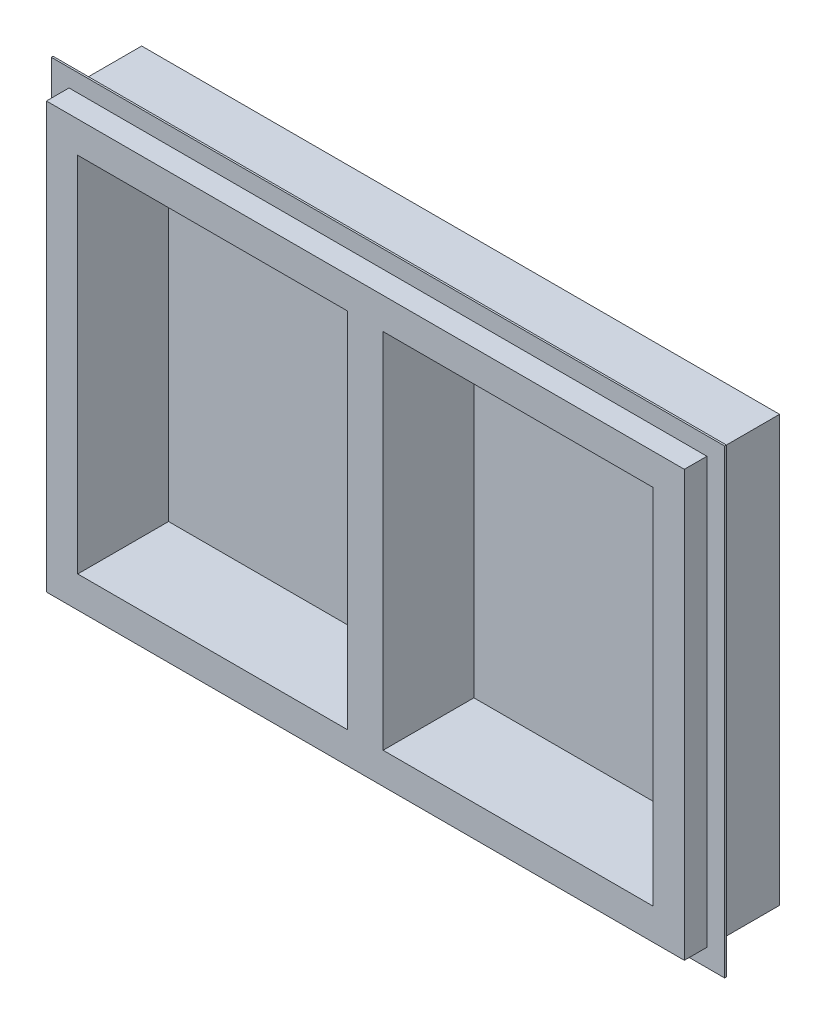
ISO-10303-21;
HEADER;
FILE_DESCRIPTION(('STEP AP214'),'2;1');
FILE_NAME('part.step','',(''),(''),'','','');
FILE_SCHEMA(('AUTOMOTIVE_DESIGN { 1 0 10303 214 1 1 1 1 }'));
ENDSEC;
DATA;
#1=APPLICATION_CONTEXT('core data for automotive mechanical design processes');
#2=APPLICATION_PROTOCOL_DEFINITION('international standard','automotive_design',2000,#1);
#3=PRODUCT_CONTEXT('',#1,'mechanical');
#4=PRODUCT('Part','Part','',(#3));
#5=PRODUCT_RELATED_PRODUCT_CATEGORY('part','',(#4));
#6=PRODUCT_DEFINITION_FORMATION('','',#4);
#7=PRODUCT_DEFINITION_CONTEXT('part definition',#1,'design');
#8=PRODUCT_DEFINITION('design','',#6,#7);
#9=PRODUCT_DEFINITION_SHAPE('','',#8);
#10=(LENGTH_UNIT() NAMED_UNIT(*) SI_UNIT(.MILLI.,.METRE.));
#11=(NAMED_UNIT(*) PLANE_ANGLE_UNIT() SI_UNIT($,.RADIAN.));
#12=(NAMED_UNIT(*) SI_UNIT($,.STERADIAN.) SOLID_ANGLE_UNIT());
#13=UNCERTAINTY_MEASURE_WITH_UNIT(LENGTH_MEASURE(1.E-05),#10,'distance_accuracy_value','');
#14=(GEOMETRIC_REPRESENTATION_CONTEXT(3) GLOBAL_UNCERTAINTY_ASSIGNED_CONTEXT((#13)) GLOBAL_UNIT_ASSIGNED_CONTEXT((#10,
#11,#12)) REPRESENTATION_CONTEXT('',''));
#15=CARTESIAN_POINT('',(0.,0.,0.));
#16=DIRECTION('',(0.,0.,1.));
#17=DIRECTION('',(1.,0.,0.));
#18=AXIS2_PLACEMENT_3D('',#15,#16,#17);
#19=CARTESIAN_POINT('',(44.9012806053457,564.698719394654,136.525));
#20=DIRECTION('',(1.,0.,0.));
#21=DIRECTION('',(0.,0.,-1.));
#22=AXIS2_PLACEMENT_3D('',#19,#20,#21);
#23=PLANE('',#22);
#24=DIRECTION('',(0.,0.,-1.));
#25=VECTOR('',#24,1.);
#26=CARTESIAN_POINT('',(44.9012806053457,44.9012806053458,136.525));
#27=LINE('',#26,#25);
#28=CARTESIAN_POINT('',(44.9012806053457,44.9012806053458,136.525));
#29=VERTEX_POINT('',#28);
#30=CARTESIAN_POINT('',(44.9012806053457,44.9012806053458,6.35));
#31=VERTEX_POINT('',#30);
#32=EDGE_CURVE('E392',#29,#31,#27,.T.);
#33=ORIENTED_EDGE('',*,*,#32,.T.);
#34=DIRECTION('',(0.,1.,0.));
#35=VECTOR('',#34,1.);
#36=CARTESIAN_POINT('',(44.9012806053457,564.698719394654,6.35));
#37=LINE('',#36,#35);
#38=CARTESIAN_POINT('',(44.9012806053457,564.698719394654,6.35));
#39=VERTEX_POINT('',#38);
#40=EDGE_CURVE('E263',#31,#39,#37,.T.);
#41=ORIENTED_EDGE('',*,*,#40,.T.);
#42=DIRECTION('',(0.,0.,-1.));
#43=VECTOR('',#42,1.);
#44=CARTESIAN_POINT('',(44.9012806053457,564.698719394654,136.525));
#45=LINE('',#44,#43);
#46=CARTESIAN_POINT('',(44.9012806053457,564.698719394654,136.525));
#47=VERTEX_POINT('',#46);
#48=EDGE_CURVE('E383',#47,#39,#45,.T.);
#49=ORIENTED_EDGE('',*,*,#48,.F.);
#50=DIRECTION('',(0.,-1.,0.));
#51=VECTOR('',#50,1.);
#52=CARTESIAN_POINT('',(44.9012806053457,564.698719394654,136.525));
#53=LINE('',#52,#51);
#54=EDGE_CURVE('E374',#47,#29,#53,.T.);
#55=ORIENTED_EDGE('',*,*,#54,.T.);
#56=EDGE_LOOP('',(#33,#41,#49,#55));
#57=FACE_BOUND('',#56,.T.);
#58=ADVANCED_FACE('F38',(#57),#23,.T.);
#59=CARTESIAN_POINT('',(44.9012806053457,44.9012806053458,136.525));
#60=DIRECTION('',(0.,1.,0.));
#61=DIRECTION('',(0.,0.,1.));
#62=AXIS2_PLACEMENT_3D('',#59,#60,#61);
#63=PLANE('',#62);
#64=DIRECTION('',(0.,0.,-1.));
#65=VECTOR('',#64,1.);
#66=CARTESIAN_POINT('',(431.8,44.9012806053458,136.525));
#67=LINE('',#66,#65);
#68=CARTESIAN_POINT('',(431.8,44.9012806053458,136.525));
#69=VERTEX_POINT('',#68);
#70=CARTESIAN_POINT('',(431.8,44.9012806053458,6.35));
#71=VERTEX_POINT('',#70);
#72=EDGE_CURVE('E389',#69,#71,#67,.T.);
#73=ORIENTED_EDGE('',*,*,#72,.T.);
#74=DIRECTION('',(-1.,0.,0.));
#75=VECTOR('',#74,1.);
#76=CARTESIAN_POINT('',(431.8,44.9012806053458,6.35));
#77=LINE('',#76,#75);
#78=EDGE_CURVE('E260',#71,#31,#77,.T.);
#79=ORIENTED_EDGE('',*,*,#78,.T.);
#80=ORIENTED_EDGE('',*,*,#32,.F.);
#81=DIRECTION('',(1.,0.,0.));
#82=VECTOR('',#81,1.);
#83=CARTESIAN_POINT('',(44.9012806053457,44.9012806053458,136.525));
#84=LINE('',#83,#82);
#85=EDGE_CURVE('E376',#29,#69,#84,.T.);
#86=ORIENTED_EDGE('',*,*,#85,.T.);
#87=EDGE_LOOP('',(#73,#79,#80,#86));
#88=FACE_BOUND('',#87,.T.);
#89=ADVANCED_FACE('F482',(#88),#63,.T.);
#90=CARTESIAN_POINT('',(431.8,564.698719394654,136.525));
#91=DIRECTION('',(-1.,0.,0.));
#92=DIRECTION('',(0.,0.,1.));
#93=AXIS2_PLACEMENT_3D('',#90,#91,#92);
#94=PLANE('',#93);
#95=DIRECTION('',(0.,0.,-1.));
#96=VECTOR('',#95,1.);
#97=CARTESIAN_POINT('',(431.8,564.698719394654,136.525));
#98=LINE('',#97,#96);
#99=CARTESIAN_POINT('',(431.8,564.698719394654,136.525));
#100=VERTEX_POINT('',#99);
#101=CARTESIAN_POINT('',(431.8,564.698719394654,6.34999999999999));
#102=VERTEX_POINT('',#101);
#103=EDGE_CURVE('E386',#100,#102,#98,.T.);
#104=ORIENTED_EDGE('',*,*,#103,.T.);
#105=DIRECTION('',(0.,-1.,0.));
#106=VECTOR('',#105,1.);
#107=CARTESIAN_POINT('',(431.8,564.698719394654,6.35));
#108=LINE('',#107,#106);
#109=EDGE_CURVE('E53',#102,#71,#108,.T.);
#110=ORIENTED_EDGE('',*,*,#109,.T.);
#111=ORIENTED_EDGE('',*,*,#72,.F.);
#112=DIRECTION('',(0.,1.,0.));
#113=VECTOR('',#112,1.);
#114=CARTESIAN_POINT('',(431.8,564.698719394654,136.525));
#115=LINE('',#114,#113);
#116=EDGE_CURVE('E378',#69,#100,#115,.T.);
#117=ORIENTED_EDGE('',*,*,#116,.T.);
#118=EDGE_LOOP('',(#104,#110,#111,#117));
#119=FACE_BOUND('',#118,.T.);
#120=ADVANCED_FACE('F488',(#119),#94,.T.);
#121=CARTESIAN_POINT('',(44.9012806053457,564.698719394654,136.525));
#122=DIRECTION('',(0.,-1.,0.));
#123=DIRECTION('',(0.,0.,-1.));
#124=AXIS2_PLACEMENT_3D('',#121,#122,#123);
#125=PLANE('',#124);
#126=ORIENTED_EDGE('',*,*,#48,.T.);
#127=DIRECTION('',(1.,0.,0.));
#128=VECTOR('',#127,1.);
#129=CARTESIAN_POINT('',(431.8,564.698719394654,6.35));
#130=LINE('',#129,#128);
#131=EDGE_CURVE('E240',#39,#102,#130,.T.);
#132=ORIENTED_EDGE('',*,*,#131,.T.);
#133=ORIENTED_EDGE('',*,*,#103,.F.);
#134=DIRECTION('',(-1.,0.,0.));
#135=VECTOR('',#134,1.);
#136=CARTESIAN_POINT('',(44.9012806053457,564.698719394654,136.525));
#137=LINE('',#136,#135);
#138=EDGE_CURVE('E381',#100,#47,#137,.T.);
#139=ORIENTED_EDGE('',*,*,#138,.T.);
#140=EDGE_LOOP('',(#126,#132,#133,#139));
#141=FACE_BOUND('',#140,.T.);
#142=ADVANCED_FACE('F723',(#141),#125,.T.);
#143=CARTESIAN_POINT('',(482.6,44.9012806053458,136.525));
#144=DIRECTION('',(1.,0.,0.));
#145=DIRECTION('',(0.,0.,-1.));
#146=AXIS2_PLACEMENT_3D('',#143,#144,#145);
#147=PLANE('',#146);
#148=DIRECTION('',(0.,0.,-1.));
#149=VECTOR('',#148,1.);
#150=CARTESIAN_POINT('',(482.6,44.9012806053458,136.525));
#151=LINE('',#150,#149);
#152=CARTESIAN_POINT('',(482.6,44.9012806053458,136.525));
#153=VERTEX_POINT('',#152);
#154=CARTESIAN_POINT('',(482.6,44.9012806053458,6.35));
#155=VERTEX_POINT('',#154);
#156=EDGE_CURVE('E371',#153,#155,#151,.T.);
#157=ORIENTED_EDGE('',*,*,#156,.T.);
#158=DIRECTION('',(0.,1.,0.));
#159=VECTOR('',#158,1.);
#160=CARTESIAN_POINT('',(482.6,564.698719394654,6.35));
#161=LINE('',#160,#159);
#162=CARTESIAN_POINT('',(482.6,564.698719394654,6.35));
#163=VERTEX_POINT('',#162);
#164=EDGE_CURVE('E288',#155,#163,#161,.T.);
#165=ORIENTED_EDGE('',*,*,#164,.T.);
#166=DIRECTION('',(0.,0.,-1.));
#167=VECTOR('',#166,1.);
#168=CARTESIAN_POINT('',(482.6,564.698719394654,136.525));
#169=LINE('',#168,#167);
#170=CARTESIAN_POINT('',(482.6,564.698719394654,136.525));
#171=VERTEX_POINT('',#170);
#172=EDGE_CURVE('E362',#171,#163,#169,.T.);
#173=ORIENTED_EDGE('',*,*,#172,.F.);
#174=DIRECTION('',(0.,-1.,0.));
#175=VECTOR('',#174,1.);
#176=CARTESIAN_POINT('',(482.6,44.9012806053458,136.525));
#177=LINE('',#176,#175);
#178=EDGE_CURVE('E353',#171,#153,#177,.T.);
#179=ORIENTED_EDGE('',*,*,#178,.T.);
#180=EDGE_LOOP('',(#157,#165,#173,#179));
#181=FACE_BOUND('',#180,.T.);
#182=ADVANCED_FACE('F733',(#181),#147,.T.);
#183=CARTESIAN_POINT('',(482.6,44.9012806053458,136.525));
#184=DIRECTION('',(0.,1.,0.));
#185=DIRECTION('',(0.,0.,1.));
#186=AXIS2_PLACEMENT_3D('',#183,#184,#185);
#187=PLANE('',#186);
#188=DIRECTION('',(0.,0.,-1.));
#189=VECTOR('',#188,1.);
#190=CARTESIAN_POINT('',(869.498719394654,44.9012806053458,136.525));
#191=LINE('',#190,#189);
#192=CARTESIAN_POINT('',(869.498719394654,44.9012806053458,136.525));
#193=VERTEX_POINT('',#192);
#194=CARTESIAN_POINT('',(869.498719394654,44.9012806053458,6.35));
#195=VERTEX_POINT('',#194);
#196=EDGE_CURVE('E368',#193,#195,#191,.T.);
#197=ORIENTED_EDGE('',*,*,#196,.T.);
#198=DIRECTION('',(-1.,0.,0.));
#199=VECTOR('',#198,1.);
#200=CARTESIAN_POINT('',(869.498719394654,44.9012806053458,6.35));
#201=LINE('',#200,#199);
#202=EDGE_CURVE('E285',#195,#155,#201,.T.);
#203=ORIENTED_EDGE('',*,*,#202,.T.);
#204=ORIENTED_EDGE('',*,*,#156,.F.);
#205=DIRECTION('',(1.,0.,0.));
#206=VECTOR('',#205,1.);
#207=CARTESIAN_POINT('',(482.6,44.9012806053458,136.525));
#208=LINE('',#207,#206);
#209=EDGE_CURVE('E355',#153,#193,#208,.T.);
#210=ORIENTED_EDGE('',*,*,#209,.T.);
#211=EDGE_LOOP('',(#197,#203,#204,#210));
#212=FACE_BOUND('',#211,.T.);
#213=ADVANCED_FACE('F744',(#212),#187,.T.);
#214=CARTESIAN_POINT('',(869.498719394654,44.9012806053458,136.525));
#215=DIRECTION('',(-1.,0.,0.));
#216=DIRECTION('',(0.,0.,1.));
#217=AXIS2_PLACEMENT_3D('',#214,#215,#216);
#218=PLANE('',#217);
#219=DIRECTION('',(0.,0.,-1.));
#220=VECTOR('',#219,1.);
#221=CARTESIAN_POINT('',(869.498719394654,564.698719394654,136.525));
#222=LINE('',#221,#220);
#223=CARTESIAN_POINT('',(869.498719394654,564.698719394654,136.525));
#224=VERTEX_POINT('',#223);
#225=CARTESIAN_POINT('',(869.498719394654,564.698719394654,6.34999999999999));
#226=VERTEX_POINT('',#225);
#227=EDGE_CURVE('E365',#224,#226,#222,.T.);
#228=ORIENTED_EDGE('',*,*,#227,.T.);
#229=DIRECTION('',(0.,-1.,0.));
#230=VECTOR('',#229,1.);
#231=CARTESIAN_POINT('',(869.498719394654,564.698719394654,6.35));
#232=LINE('',#231,#230);
#233=EDGE_CURVE('E61',#226,#195,#232,.T.);
#234=ORIENTED_EDGE('',*,*,#233,.T.);
#235=ORIENTED_EDGE('',*,*,#196,.F.);
#236=DIRECTION('',(0.,1.,0.));
#237=VECTOR('',#236,1.);
#238=CARTESIAN_POINT('',(869.498719394654,44.9012806053458,136.525));
#239=LINE('',#238,#237);
#240=EDGE_CURVE('E357',#193,#224,#239,.T.);
#241=ORIENTED_EDGE('',*,*,#240,.T.);
#242=EDGE_LOOP('',(#228,#234,#235,#241));
#243=FACE_BOUND('',#242,.T.);
#244=ADVANCED_FACE('F755',(#243),#218,.T.);
#245=CARTESIAN_POINT('',(482.6,564.698719394654,136.525));
#246=DIRECTION('',(0.,-1.,0.));
#247=DIRECTION('',(0.,0.,-1.));
#248=AXIS2_PLACEMENT_3D('',#245,#246,#247);
#249=PLANE('',#248);
#250=ORIENTED_EDGE('',*,*,#172,.T.);
#251=DIRECTION('',(1.,0.,0.));
#252=VECTOR('',#251,1.);
#253=CARTESIAN_POINT('',(869.498719394654,564.698719394654,6.35));
#254=LINE('',#253,#252);
#255=EDGE_CURVE('E291',#163,#226,#254,.T.);
#256=ORIENTED_EDGE('',*,*,#255,.T.);
#257=ORIENTED_EDGE('',*,*,#227,.F.);
#258=DIRECTION('',(-1.,0.,0.));
#259=VECTOR('',#258,1.);
#260=CARTESIAN_POINT('',(482.6,564.698719394654,136.525));
#261=LINE('',#260,#259);
#262=EDGE_CURVE('E360',#224,#171,#261,.T.);
#263=ORIENTED_EDGE('',*,*,#262,.T.);
#264=EDGE_LOOP('',(#250,#256,#257,#263));
#265=FACE_BOUND('',#264,.T.);
#266=ADVANCED_FACE('F516',(#265),#249,.T.);
#267=CARTESIAN_POINT('',(0.,0.,101.6));
#268=DIRECTION('',(0.,0.,-1.));
#269=DIRECTION('',(-1.,0.,0.));
#270=AXIS2_PLACEMENT_3D('',#267,#268,#269);
#271=PLANE('',#270);
#272=DIRECTION('',(0.,-1.,0.));
#273=VECTOR('',#272,1.);
#274=CARTESIAN_POINT('',(-25.3999999999999,-25.4000000000001,101.6));
#275=LINE('',#274,#273);
#276=CARTESIAN_POINT('',(-25.3999999999999,635.,101.6));
#277=VERTEX_POINT('',#276);
#278=CARTESIAN_POINT('',(-25.3999999999999,-25.4000000000001,101.6));
#279=VERTEX_POINT('',#278);
#280=EDGE_CURVE('E428',#277,#279,#275,.T.);
#281=ORIENTED_EDGE('',*,*,#280,.F.);
#282=DIRECTION('',(-1.,0.,0.));
#283=VECTOR('',#282,1.);
#284=CARTESIAN_POINT('',(0.,635.,101.6));
#285=LINE('',#284,#283);
#286=CARTESIAN_POINT('',(939.8,635.,101.6));
#287=VERTEX_POINT('',#286);
#288=EDGE_CURVE('E433',#287,#277,#285,.T.);
#289=ORIENTED_EDGE('',*,*,#288,.F.);
#290=DIRECTION('',(0.,1.,0.));
#291=VECTOR('',#290,1.);
#292=CARTESIAN_POINT('',(939.8,635.,101.6));
#293=LINE('',#292,#291);
#294=CARTESIAN_POINT('',(939.8,-25.4,101.6));
#295=VERTEX_POINT('',#294);
#296=EDGE_CURVE('E444',#295,#287,#293,.T.);
#297=ORIENTED_EDGE('',*,*,#296,.F.);
#298=DIRECTION('',(1.,0.,0.));
#299=VECTOR('',#298,1.);
#300=CARTESIAN_POINT('',(939.8,-25.4,101.6));
#301=LINE('',#300,#299);
#302=EDGE_CURVE('E442',#279,#295,#301,.T.);
#303=ORIENTED_EDGE('',*,*,#302,.F.);
#304=EDGE_LOOP('',(#281,#289,#297,#303));
#305=FACE_BOUND('',#304,.T.);
#306=DIRECTION('',(-1.,0.,0.));
#307=VECTOR('',#306,1.);
#308=CARTESIAN_POINT('',(0.,609.6,101.6));
#309=LINE('',#308,#307);
#310=CARTESIAN_POINT('',(914.4,609.6,101.6));
#311=VERTEX_POINT('',#310);
#312=CARTESIAN_POINT('',(0.,609.6,101.6));
#313=VERTEX_POINT('',#312);
#314=EDGE_CURVE('E331',#311,#313,#309,.T.);
#315=ORIENTED_EDGE('',*,*,#314,.T.);
#316=DIRECTION('',(0.,-1.,0.));
#317=VECTOR('',#316,1.);
#318=CARTESIAN_POINT('',(0.,0.,101.6));
#319=LINE('',#318,#317);
#320=CARTESIAN_POINT('',(0.,0.,101.6));
#321=VERTEX_POINT('',#320);
#322=EDGE_CURVE('E321',#313,#321,#319,.T.);
#323=ORIENTED_EDGE('',*,*,#322,.T.);
#324=DIRECTION('',(1.,0.,0.));
#325=VECTOR('',#324,1.);
#326=CARTESIAN_POINT('',(0.,0.,101.6));
#327=LINE('',#326,#325);
#328=CARTESIAN_POINT('',(914.4,0.,101.6));
#329=VERTEX_POINT('',#328);
#330=EDGE_CURVE('E324',#321,#329,#327,.T.);
#331=ORIENTED_EDGE('',*,*,#330,.T.);
#332=DIRECTION('',(0.,1.,0.));
#333=VECTOR('',#332,1.);
#334=CARTESIAN_POINT('',(914.4,0.,101.6));
#335=LINE('',#334,#333);
#336=EDGE_CURVE('E328',#329,#311,#335,.T.);
#337=ORIENTED_EDGE('',*,*,#336,.T.);
#338=EDGE_LOOP('',(#315,#323,#331,#337));
#339=FACE_BOUND('',#338,.T.);
#340=ADVANCED_FACE('F462',(#305,#339),#271,.T.);
#341=CARTESIAN_POINT('',(0.,0.,104.14));
#342=DIRECTION('',(0.,0.,-1.));
#343=DIRECTION('',(-1.,0.,0.));
#344=AXIS2_PLACEMENT_3D('',#341,#342,#343);
#345=PLANE('',#344);
#346=DIRECTION('',(-1.,0.,0.));
#347=VECTOR('',#346,1.);
#348=CARTESIAN_POINT('',(-25.3999999999999,635.,104.14));
#349=LINE('',#348,#347);
#350=CARTESIAN_POINT('',(939.8,635.,104.14));
#351=VERTEX_POINT('',#350);
#352=CARTESIAN_POINT('',(-25.3999999999999,635.,104.14));
#353=VERTEX_POINT('',#352);
#354=EDGE_CURVE('E429',#351,#353,#349,.T.);
#355=ORIENTED_EDGE('',*,*,#354,.T.);
#356=DIRECTION('',(0.,-1.,0.));
#357=VECTOR('',#356,1.);
#358=CARTESIAN_POINT('',(-25.3999999999999,-25.4000000000001,104.14));
#359=LINE('',#358,#357);
#360=CARTESIAN_POINT('',(-25.3999999999999,-25.4000000000001,104.14));
#361=VERTEX_POINT('',#360);
#362=EDGE_CURVE('E432',#353,#361,#359,.T.);
#363=ORIENTED_EDGE('',*,*,#362,.T.);
#364=DIRECTION('',(1.,0.,0.));
#365=VECTOR('',#364,1.);
#366=CARTESIAN_POINT('',(939.8,-25.4,104.14));
#367=LINE('',#366,#365);
#368=CARTESIAN_POINT('',(939.8,-25.4,104.14));
#369=VERTEX_POINT('',#368);
#370=EDGE_CURVE('E435',#361,#369,#367,.T.);
#371=ORIENTED_EDGE('',*,*,#370,.T.);
#372=DIRECTION('',(0.,1.,0.));
#373=VECTOR('',#372,1.);
#374=CARTESIAN_POINT('',(939.8,635.,104.14));
#375=LINE('',#374,#373);
#376=EDGE_CURVE('E437',#369,#351,#375,.T.);
#377=ORIENTED_EDGE('',*,*,#376,.T.);
#378=EDGE_LOOP('',(#355,#363,#371,#377));
#379=FACE_BOUND('',#378,.T.);
#380=DIRECTION('',(0.,-1.,0.));
#381=VECTOR('',#380,1.);
#382=CARTESIAN_POINT('',(0.,609.6,104.14));
#383=LINE('',#382,#381);
#384=CARTESIAN_POINT('',(0.,609.6,104.14));
#385=VERTEX_POINT('',#384);
#386=CARTESIAN_POINT('',(0.,0.,104.14));
#387=VERTEX_POINT('',#386);
#388=EDGE_CURVE('E416',#385,#387,#383,.T.);
#389=ORIENTED_EDGE('',*,*,#388,.F.);
#390=DIRECTION('',(-1.,0.,0.));
#391=VECTOR('',#390,1.);
#392=CARTESIAN_POINT('',(0.,609.6,104.14));
#393=LINE('',#392,#391);
#394=CARTESIAN_POINT('',(914.4,609.6,104.14));
#395=VERTEX_POINT('',#394);
#396=EDGE_CURVE('E425',#395,#385,#393,.T.);
#397=ORIENTED_EDGE('',*,*,#396,.F.);
#398=DIRECTION('',(0.,1.,0.));
#399=VECTOR('',#398,1.);
#400=CARTESIAN_POINT('',(914.4,609.6,104.14));
#401=LINE('',#400,#399);
#402=CARTESIAN_POINT('',(914.4,0.,104.14));
#403=VERTEX_POINT('',#402);
#404=EDGE_CURVE('E422',#403,#395,#401,.T.);
#405=ORIENTED_EDGE('',*,*,#404,.F.);
#406=DIRECTION('',(1.,0.,0.));
#407=VECTOR('',#406,1.);
#408=CARTESIAN_POINT('',(0.,0.,104.14));
#409=LINE('',#408,#407);
#410=EDGE_CURVE('E419',#387,#403,#409,.T.);
#411=ORIENTED_EDGE('',*,*,#410,.F.);
#412=EDGE_LOOP('',(#389,#397,#405,#411));
#413=FACE_BOUND('',#412,.T.);
#414=ADVANCED_FACE('F473',(#379,#413),#345,.F.);
#415=CARTESIAN_POINT('',(-25.3999999999999,-25.4000000000001,104.14));
#416=DIRECTION('',(1.,0.,0.));
#417=DIRECTION('',(0.,0.,-1.));
#418=AXIS2_PLACEMENT_3D('',#415,#416,#417);
#419=PLANE('',#418);
#420=ORIENTED_EDGE('',*,*,#280,.T.);
#421=DIRECTION('',(0.,0.,-1.));
#422=VECTOR('',#421,1.);
#423=CARTESIAN_POINT('',(-25.3999999999999,-25.4000000000001,104.14));
#424=LINE('',#423,#422);
#425=EDGE_CURVE('E46',#361,#279,#424,.T.);
#426=ORIENTED_EDGE('',*,*,#425,.F.);
#427=ORIENTED_EDGE('',*,*,#362,.F.);
#428=DIRECTION('',(0.,0.,-1.));
#429=VECTOR('',#428,1.);
#430=CARTESIAN_POINT('',(-25.3999999999999,635.,104.14));
#431=LINE('',#430,#429);
#432=EDGE_CURVE('E11',#353,#277,#431,.T.);
#433=ORIENTED_EDGE('',*,*,#432,.T.);
#434=EDGE_LOOP('',(#420,#426,#427,#433));
#435=FACE_BOUND('',#434,.T.);
#436=ADVANCED_FACE('F40',(#435),#419,.F.);
#437=CARTESIAN_POINT('',(939.8,-25.4,104.14));
#438=DIRECTION('',(0.,1.,0.));
#439=DIRECTION('',(-1.,0.,0.));
#440=AXIS2_PLACEMENT_3D('',#437,#438,#439);
#441=PLANE('',#440);
#442=ORIENTED_EDGE('',*,*,#302,.T.);
#443=DIRECTION('',(0.,0.,-1.));
#444=VECTOR('',#443,1.);
#445=CARTESIAN_POINT('',(939.8,-25.4,104.14));
#446=LINE('',#445,#444);
#447=EDGE_CURVE('E449',#369,#295,#446,.T.);
#448=ORIENTED_EDGE('',*,*,#447,.F.);
#449=ORIENTED_EDGE('',*,*,#370,.F.);
#450=ORIENTED_EDGE('',*,*,#425,.T.);
#451=EDGE_LOOP('',(#442,#448,#449,#450));
#452=FACE_BOUND('',#451,.T.);
#453=ADVANCED_FACE('F456',(#452),#441,.F.);
#454=CARTESIAN_POINT('',(939.8,635.,104.14));
#455=DIRECTION('',(-1.,0.,0.));
#456=DIRECTION('',(0.,-1.,0.));
#457=AXIS2_PLACEMENT_3D('',#454,#455,#456);
#458=PLANE('',#457);
#459=ORIENTED_EDGE('',*,*,#296,.T.);
#460=DIRECTION('',(0.,0.,-1.));
#461=VECTOR('',#460,1.);
#462=CARTESIAN_POINT('',(939.8,635.,104.14));
#463=LINE('',#462,#461);
#464=EDGE_CURVE('E440',#351,#287,#463,.T.);
#465=ORIENTED_EDGE('',*,*,#464,.F.);
#466=ORIENTED_EDGE('',*,*,#376,.F.);
#467=ORIENTED_EDGE('',*,*,#447,.T.);
#468=EDGE_LOOP('',(#459,#465,#466,#467));
#469=FACE_BOUND('',#468,.T.);
#470=ADVANCED_FACE('F467',(#469),#458,.F.);
#471=CARTESIAN_POINT('',(0.,635.,104.14));
#472=DIRECTION('',(0.,-1.,0.));
#473=DIRECTION('',(0.,0.,-1.));
#474=AXIS2_PLACEMENT_3D('',#471,#472,#473);
#475=PLANE('',#474);
#476=ORIENTED_EDGE('',*,*,#288,.T.);
#477=ORIENTED_EDGE('',*,*,#432,.F.);
#478=ORIENTED_EDGE('',*,*,#354,.F.);
#479=ORIENTED_EDGE('',*,*,#464,.T.);
#480=EDGE_LOOP('',(#476,#477,#478,#479));
#481=FACE_BOUND('',#480,.T.);
#482=ADVANCED_FACE('F470',(#481),#475,.F.);
#483=CARTESIAN_POINT('',(0.,0.,136.525));
#484=DIRECTION('',(0.,1.,0.));
#485=DIRECTION('',(0.,0.,1.));
#486=AXIS2_PLACEMENT_3D('',#483,#484,#485);
#487=PLANE('',#486);
#488=DIRECTION('',(0.,0.,-1.));
#489=VECTOR('',#488,1.);
#490=CARTESIAN_POINT('',(0.,0.,136.525));
#491=LINE('',#490,#489);
#492=CARTESIAN_POINT('',(0.,0.,136.525));
#493=VERTEX_POINT('',#492);
#494=EDGE_CURVE('E413',#493,#387,#491,.T.);
#495=ORIENTED_EDGE('',*,*,#494,.T.);
#496=ORIENTED_EDGE('',*,*,#410,.T.);
#497=DIRECTION('',(0.,0.,-1.));
#498=VECTOR('',#497,1.);
#499=CARTESIAN_POINT('',(914.4,0.,136.525));
#500=LINE('',#499,#498);
#501=CARTESIAN_POINT('',(914.4,0.,136.525));
#502=VERTEX_POINT('',#501);
#503=EDGE_CURVE('E410',#502,#403,#500,.T.);
#504=ORIENTED_EDGE('',*,*,#503,.F.);
#505=DIRECTION('',(1.,0.,0.));
#506=VECTOR('',#505,1.);
#507=CARTESIAN_POINT('',(0.,0.,136.525));
#508=LINE('',#507,#506);
#509=EDGE_CURVE('E398',#493,#502,#508,.T.);
#510=ORIENTED_EDGE('',*,*,#509,.F.);
#511=EDGE_LOOP('',(#495,#496,#504,#510));
#512=FACE_BOUND('',#511,.T.);
#513=ADVANCED_FACE('F503',(#512),#487,.F.);
#514=CARTESIAN_POINT('',(0.,609.6,136.525));
#515=DIRECTION('',(0.,-1.,0.));
#516=DIRECTION('',(0.,0.,-1.));
#517=AXIS2_PLACEMENT_3D('',#514,#515,#516);
#518=PLANE('',#517);
#519=DIRECTION('',(0.,0.,-1.));
#520=VECTOR('',#519,1.);
#521=CARTESIAN_POINT('',(914.4,609.6,136.525));
#522=LINE('',#521,#520);
#523=CARTESIAN_POINT('',(914.4,609.6,136.525));
#524=VERTEX_POINT('',#523);
#525=EDGE_CURVE('E407',#524,#395,#522,.T.);
#526=ORIENTED_EDGE('',*,*,#525,.T.);
#527=ORIENTED_EDGE('',*,*,#396,.T.);
#528=DIRECTION('',(0.,0.,-1.));
#529=VECTOR('',#528,1.);
#530=CARTESIAN_POINT('',(0.,609.6,136.525));
#531=LINE('',#530,#529);
#532=CARTESIAN_POINT('',(0.,609.6,136.525));
#533=VERTEX_POINT('',#532);
#534=EDGE_CURVE('E404',#533,#385,#531,.T.);
#535=ORIENTED_EDGE('',*,*,#534,.F.);
#536=DIRECTION('',(-1.,0.,0.));
#537=VECTOR('',#536,1.);
#538=CARTESIAN_POINT('',(0.,609.6,136.525));
#539=LINE('',#538,#537);
#540=EDGE_CURVE('E402',#524,#533,#539,.T.);
#541=ORIENTED_EDGE('',*,*,#540,.F.);
#542=EDGE_LOOP('',(#526,#527,#535,#541));
#543=FACE_BOUND('',#542,.T.);
#544=ADVANCED_FACE('F499',(#543),#518,.F.);
#545=CARTESIAN_POINT('',(0.,609.6,136.525));
#546=DIRECTION('',(1.,0.,0.));
#547=DIRECTION('',(0.,0.,-1.));
#548=AXIS2_PLACEMENT_3D('',#545,#546,#547);
#549=PLANE('',#548);
#550=ORIENTED_EDGE('',*,*,#534,.T.);
#551=ORIENTED_EDGE('',*,*,#388,.T.);
#552=ORIENTED_EDGE('',*,*,#494,.F.);
#553=DIRECTION('',(0.,-1.,0.));
#554=VECTOR('',#553,1.);
#555=CARTESIAN_POINT('',(0.,609.6,136.525));
#556=LINE('',#555,#554);
#557=EDGE_CURVE('E395',#533,#493,#556,.T.);
#558=ORIENTED_EDGE('',*,*,#557,.F.);
#559=EDGE_LOOP('',(#550,#551,#552,#558));
#560=FACE_BOUND('',#559,.T.);
#561=ADVANCED_FACE('F502',(#560),#549,.F.);
#562=CARTESIAN_POINT('',(914.4,609.6,136.525));
#563=DIRECTION('',(-1.,0.,0.));
#564=DIRECTION('',(0.,0.,1.));
#565=AXIS2_PLACEMENT_3D('',#562,#563,#564);
#566=PLANE('',#565);
#567=ORIENTED_EDGE('',*,*,#503,.T.);
#568=ORIENTED_EDGE('',*,*,#404,.T.);
#569=ORIENTED_EDGE('',*,*,#525,.F.);
#570=DIRECTION('',(0.,1.,0.));
#571=VECTOR('',#570,1.);
#572=CARTESIAN_POINT('',(914.4,609.6,136.525));
#573=LINE('',#572,#571);
#574=EDGE_CURVE('E400',#502,#524,#573,.T.);
#575=ORIENTED_EDGE('',*,*,#574,.F.);
#576=EDGE_LOOP('',(#567,#568,#569,#575));
#577=FACE_BOUND('',#576,.T.);
#578=ADVANCED_FACE('F497',(#577),#566,.F.);
#579=CARTESIAN_POINT('',(0.,0.,136.525));
#580=DIRECTION('',(0.,0.,1.));
#581=DIRECTION('',(1.,0.,0.));
#582=AXIS2_PLACEMENT_3D('',#579,#580,#581);
#583=PLANE('',#582);
#584=ORIENTED_EDGE('',*,*,#557,.T.);
#585=ORIENTED_EDGE('',*,*,#509,.T.);
#586=ORIENTED_EDGE('',*,*,#574,.T.);
#587=ORIENTED_EDGE('',*,*,#540,.T.);
#588=EDGE_LOOP('',(#584,#585,#586,#587));
#589=FACE_BOUND('',#588,.T.);
#590=ORIENTED_EDGE('',*,*,#85,.F.);
#591=ORIENTED_EDGE('',*,*,#54,.F.);
#592=ORIENTED_EDGE('',*,*,#138,.F.);
#593=ORIENTED_EDGE('',*,*,#116,.F.);
#594=EDGE_LOOP('',(#590,#591,#592,#593));
#595=FACE_BOUND('',#594,.T.);
#596=ORIENTED_EDGE('',*,*,#209,.F.);
#597=ORIENTED_EDGE('',*,*,#178,.F.);
#598=ORIENTED_EDGE('',*,*,#262,.F.);
#599=ORIENTED_EDGE('',*,*,#240,.F.);
#600=EDGE_LOOP('',(#596,#597,#598,#599));
#601=FACE_BOUND('',#600,.T.);
#602=ADVANCED_FACE('F493',(#589,#595,#601),#583,.T.);
#603=CARTESIAN_POINT('',(0.,0.,0.));
#604=DIRECTION('',(0.,0.,-1.));
#605=DIRECTION('',(-1.,0.,0.));
#606=AXIS2_PLACEMENT_3D('',#603,#604,#605);
#607=PLANE('',#606);
#608=DIRECTION('',(0.,-1.,0.));
#609=VECTOR('',#608,1.);
#610=CARTESIAN_POINT('',(457.2,609.602,0.));
#611=LINE('',#610,#609);
#612=CARTESIAN_POINT('',(457.2,564.698719394654,0.));
#613=VERTEX_POINT('',#612);
#614=CARTESIAN_POINT('',(457.2,44.9012806053458,0.));
#615=VERTEX_POINT('',#614);
#616=EDGE_CURVE('E305',#613,#615,#611,.T.);
#617=ORIENTED_EDGE('',*,*,#616,.F.);
#618=ORIENTED_EDGE('',*,*,#616,.T.);
#619=EDGE_LOOP('',(#617,#618));
#620=FACE_BOUND('',#619,.T.);
#621=DIRECTION('',(-1.,0.,0.));
#622=VECTOR('',#621,1.);
#623=CARTESIAN_POINT('',(44.9012806053457,564.698719394654,0.));
#624=LINE('',#623,#622);
#625=CARTESIAN_POINT('',(869.498719394654,564.698719394654,0.));
#626=VERTEX_POINT('',#625);
#627=CARTESIAN_POINT('',(482.6,564.698719394654,0.));
#628=VERTEX_POINT('',#627);
#629=EDGE_CURVE('E311',#626,#628,#624,.T.);
#630=ORIENTED_EDGE('',*,*,#629,.T.);
#631=DIRECTION('',(0.,-1.,0.));
#632=VECTOR('',#631,1.);
#633=CARTESIAN_POINT('',(482.6,609.602,0.));
#634=LINE('',#633,#632);
#635=CARTESIAN_POINT('',(482.6,44.9012806053458,0.));
#636=VERTEX_POINT('',#635);
#637=EDGE_CURVE('E302',#628,#636,#634,.T.);
#638=ORIENTED_EDGE('',*,*,#637,.T.);
#639=DIRECTION('',(1.,0.,0.));
#640=VECTOR('',#639,1.);
#641=CARTESIAN_POINT('',(869.498719394654,44.9012806053458,0.));
#642=LINE('',#641,#640);
#643=CARTESIAN_POINT('',(869.498719394654,44.9012806053458,0.));
#644=VERTEX_POINT('',#643);
#645=EDGE_CURVE('E317',#636,#644,#642,.T.);
#646=ORIENTED_EDGE('',*,*,#645,.T.);
#647=DIRECTION('',(0.,1.,0.));
#648=VECTOR('',#647,1.);
#649=CARTESIAN_POINT('',(869.498719394654,564.698719394654,0.));
#650=LINE('',#649,#648);
#651=EDGE_CURVE('E307',#644,#626,#650,.T.);
#652=ORIENTED_EDGE('',*,*,#651,.T.);
#653=EDGE_LOOP('',(#630,#638,#646,#652));
#654=FACE_BOUND('',#653,.T.);
#655=DIRECTION('',(0.,-1.,0.));
#656=VECTOR('',#655,1.);
#657=CARTESIAN_POINT('',(0.,0.,0.));
#658=LINE('',#657,#656);
#659=CARTESIAN_POINT('',(0.,609.6,0.));
#660=VERTEX_POINT('',#659);
#661=CARTESIAN_POINT('',(0.,0.,0.));
#662=VERTEX_POINT('',#661);
#663=EDGE_CURVE('E320',#660,#662,#658,.T.);
#664=ORIENTED_EDGE('',*,*,#663,.F.);
#665=DIRECTION('',(-1.,0.,0.));
#666=VECTOR('',#665,1.);
#667=CARTESIAN_POINT('',(0.,609.6,0.));
#668=LINE('',#667,#666);
#669=CARTESIAN_POINT('',(914.4,609.6,0.));
#670=VERTEX_POINT('',#669);
#671=EDGE_CURVE('E325',#670,#660,#668,.T.);
#672=ORIENTED_EDGE('',*,*,#671,.F.);
#673=DIRECTION('',(0.,1.,0.));
#674=VECTOR('',#673,1.);
#675=CARTESIAN_POINT('',(914.4,0.,0.));
#676=LINE('',#675,#674);
#677=CARTESIAN_POINT('',(914.4,0.,0.));
#678=VERTEX_POINT('',#677);
#679=EDGE_CURVE('E339',#678,#670,#676,.T.);
#680=ORIENTED_EDGE('',*,*,#679,.F.);
#681=DIRECTION('',(1.,0.,0.));
#682=VECTOR('',#681,1.);
#683=CARTESIAN_POINT('',(0.,0.,0.));
#684=LINE('',#683,#682);
#685=EDGE_CURVE('E337',#662,#678,#684,.T.);
#686=ORIENTED_EDGE('',*,*,#685,.F.);
#687=EDGE_LOOP('',(#664,#672,#680,#686));
#688=FACE_BOUND('',#687,.T.);
#689=CARTESIAN_POINT('',(44.9012806053457,44.9012806053458,0.));
#690=VERTEX_POINT('',#689);
#691=CARTESIAN_POINT('',(431.8,44.9012806053458,0.));
#692=VERTEX_POINT('',#691);
#693=EDGE_CURVE('E318',#690,#692,#642,.T.);
#694=ORIENTED_EDGE('',*,*,#693,.T.);
#695=DIRECTION('',(0.,-1.,0.));
#696=VECTOR('',#695,1.);
#697=CARTESIAN_POINT('',(431.8,609.602,0.));
#698=LINE('',#697,#696);
#699=CARTESIAN_POINT('',(431.8,564.698719394654,0.));
#700=VERTEX_POINT('',#699);
#701=EDGE_CURVE('E236',#700,#692,#698,.T.);
#702=ORIENTED_EDGE('',*,*,#701,.F.);
#703=CARTESIAN_POINT('',(44.9012806053457,564.698719394654,0.));
#704=VERTEX_POINT('',#703);
#705=EDGE_CURVE('E310',#700,#704,#624,.T.);
#706=ORIENTED_EDGE('',*,*,#705,.T.);
#707=DIRECTION('',(0.,-1.,0.));
#708=VECTOR('',#707,1.);
#709=CARTESIAN_POINT('',(44.9012806053457,44.9012806053458,0.));
#710=LINE('',#709,#708);
#711=EDGE_CURVE('E314',#704,#690,#710,.T.);
#712=ORIENTED_EDGE('',*,*,#711,.T.);
#713=EDGE_LOOP('',(#694,#702,#706,#712));
#714=FACE_BOUND('',#713,.T.);
#715=ADVANCED_FACE('F496',(#620,#654,#688,#714),#607,.T.);
#716=CARTESIAN_POINT('',(0.,0.,101.6));
#717=DIRECTION('',(1.,0.,0.));
#718=DIRECTION('',(0.,0.,-1.));
#719=AXIS2_PLACEMENT_3D('',#716,#717,#718);
#720=PLANE('',#719);
#721=ORIENTED_EDGE('',*,*,#663,.T.);
#722=DIRECTION('',(0.,0.,-1.));
#723=VECTOR('',#722,1.);
#724=CARTESIAN_POINT('',(0.,0.,101.6));
#725=LINE('',#724,#723);
#726=EDGE_CURVE('E350',#321,#662,#725,.T.);
#727=ORIENTED_EDGE('',*,*,#726,.F.);
#728=ORIENTED_EDGE('',*,*,#322,.F.);
#729=DIRECTION('',(0.,0.,-1.));
#730=VECTOR('',#729,1.);
#731=CARTESIAN_POINT('',(0.,609.6,101.6));
#732=LINE('',#731,#730);
#733=EDGE_CURVE('E334',#313,#660,#732,.T.);
#734=ORIENTED_EDGE('',*,*,#733,.T.);
#735=EDGE_LOOP('',(#721,#727,#728,#734));
#736=FACE_BOUND('',#735,.T.);
#737=ADVANCED_FACE('F557',(#736),#720,.F.);
#738=CARTESIAN_POINT('',(0.,0.,101.6));
#739=DIRECTION('',(0.,1.,0.));
#740=DIRECTION('',(0.,0.,1.));
#741=AXIS2_PLACEMENT_3D('',#738,#739,#740);
#742=PLANE('',#741);
#743=ORIENTED_EDGE('',*,*,#685,.T.);
#744=DIRECTION('',(0.,0.,-1.));
#745=VECTOR('',#744,1.);
#746=CARTESIAN_POINT('',(914.4,0.,101.6));
#747=LINE('',#746,#745);
#748=EDGE_CURVE('E347',#329,#678,#747,.T.);
#749=ORIENTED_EDGE('',*,*,#748,.F.);
#750=ORIENTED_EDGE('',*,*,#330,.F.);
#751=ORIENTED_EDGE('',*,*,#726,.T.);
#752=EDGE_LOOP('',(#743,#749,#750,#751));
#753=FACE_BOUND('',#752,.T.);
#754=ADVANCED_FACE('F566',(#753),#742,.F.);
#755=CARTESIAN_POINT('',(914.4,0.,101.6));
#756=DIRECTION('',(-1.,0.,0.));
#757=DIRECTION('',(0.,0.,1.));
#758=AXIS2_PLACEMENT_3D('',#755,#756,#757);
#759=PLANE('',#758);
#760=ORIENTED_EDGE('',*,*,#679,.T.);
#761=DIRECTION('',(0.,0.,-1.));
#762=VECTOR('',#761,1.);
#763=CARTESIAN_POINT('',(914.4,609.6,101.6));
#764=LINE('',#763,#762);
#765=EDGE_CURVE('E344',#311,#670,#764,.T.);
#766=ORIENTED_EDGE('',*,*,#765,.F.);
#767=ORIENTED_EDGE('',*,*,#336,.F.);
#768=ORIENTED_EDGE('',*,*,#748,.T.);
#769=EDGE_LOOP('',(#760,#766,#767,#768));
#770=FACE_BOUND('',#769,.T.);
#771=ADVANCED_FACE('F574',(#770),#759,.F.);
#772=CARTESIAN_POINT('',(0.,609.6,101.6));
#773=DIRECTION('',(0.,-1.,0.));
#774=DIRECTION('',(0.,0.,-1.));
#775=AXIS2_PLACEMENT_3D('',#772,#773,#774);
#776=PLANE('',#775);
#777=ORIENTED_EDGE('',*,*,#671,.T.);
#778=ORIENTED_EDGE('',*,*,#733,.F.);
#779=ORIENTED_EDGE('',*,*,#314,.F.);
#780=ORIENTED_EDGE('',*,*,#765,.T.);
#781=EDGE_LOOP('',(#777,#778,#779,#780));
#782=FACE_BOUND('',#781,.T.);
#783=ADVANCED_FACE('F582',(#782),#776,.F.);
#784=CARTESIAN_POINT('',(0.,0.,-0.0254));
#785=DIRECTION('',(0.,0.,-1.));
#786=DIRECTION('',(-1.,0.,0.));
#787=AXIS2_PLACEMENT_3D('',#784,#785,#786);
#788=PLANE('',#787);
#789=DIRECTION('',(0.,-1.,0.));
#790=VECTOR('',#789,1.);
#791=CARTESIAN_POINT('',(869.498719394654,564.698719394654,-0.0254));
#792=LINE('',#791,#790);
#793=CARTESIAN_POINT('',(869.498719394654,564.698719394654,-0.0254));
#794=VERTEX_POINT('',#793);
#795=CARTESIAN_POINT('',(869.498719394654,44.9012806053458,-0.0254));
#796=VERTEX_POINT('',#795);
#797=EDGE_CURVE('E269',#794,#796,#792,.T.);
#798=ORIENTED_EDGE('',*,*,#797,.T.);
#799=DIRECTION('',(-1.,0.,0.));
#800=VECTOR('',#799,1.);
#801=CARTESIAN_POINT('',(869.498719394654,44.9012806053458,-0.0254));
#802=LINE('',#801,#800);
#803=CARTESIAN_POINT('',(482.6,44.9012806053458,-0.0254));
#804=VERTEX_POINT('',#803);
#805=EDGE_CURVE('E275',#796,#804,#802,.T.);
#806=ORIENTED_EDGE('',*,*,#805,.T.);
#807=DIRECTION('',(0.,1.,0.));
#808=VECTOR('',#807,1.);
#809=CARTESIAN_POINT('',(482.6,564.698719394654,-0.0254));
#810=LINE('',#809,#808);
#811=CARTESIAN_POINT('',(482.6,564.698719394654,-0.0254));
#812=VERTEX_POINT('',#811);
#813=EDGE_CURVE('E278',#804,#812,#810,.T.);
#814=ORIENTED_EDGE('',*,*,#813,.T.);
#815=DIRECTION('',(1.,0.,0.));
#816=VECTOR('',#815,1.);
#817=CARTESIAN_POINT('',(869.498719394654,564.698719394654,-0.0254));
#818=LINE('',#817,#816);
#819=EDGE_CURVE('E281',#812,#794,#818,.T.);
#820=ORIENTED_EDGE('',*,*,#819,.T.);
#821=EDGE_LOOP('',(#798,#806,#814,#820));
#822=FACE_BOUND('',#821,.T.);
#823=ADVANCED_FACE('F590',(#822),#788,.T.);
#824=CARTESIAN_POINT('',(869.498719394654,44.9012806053458,6.35));
#825=DIRECTION('',(0.,-1.,0.));
#826=DIRECTION('',(0.,0.,-1.));
#827=AXIS2_PLACEMENT_3D('',#824,#825,#826);
#828=PLANE('',#827);
#829=DIRECTION('',(0.,0.,-1.));
#830=VECTOR('',#829,1.);
#831=CARTESIAN_POINT('',(869.498719394654,44.9012806053458,6.35));
#832=LINE('',#831,#830);
#833=EDGE_CURVE('E293',#644,#796,#832,.T.);
#834=ORIENTED_EDGE('',*,*,#833,.F.);
#835=ORIENTED_EDGE('',*,*,#645,.F.);
#836=DIRECTION('',(0.,0.,-1.));
#837=VECTOR('',#836,1.);
#838=CARTESIAN_POINT('',(482.6,44.9012806053458,6.35));
#839=LINE('',#838,#837);
#840=EDGE_CURVE('E298',#636,#804,#839,.T.);
#841=ORIENTED_EDGE('',*,*,#840,.T.);
#842=ORIENTED_EDGE('',*,*,#805,.F.);
#843=EDGE_LOOP('',(#834,#835,#841,#842));
#844=FACE_BOUND('',#843,.T.);
#845=ADVANCED_FACE('F597',(#844),#828,.T.);
#846=CARTESIAN_POINT('',(482.6,564.698719394654,6.35));
#847=DIRECTION('',(-1.,0.,0.));
#848=DIRECTION('',(0.,0.,1.));
#849=AXIS2_PLACEMENT_3D('',#846,#847,#848);
#850=PLANE('',#849);
#851=ORIENTED_EDGE('',*,*,#840,.F.);
#852=ORIENTED_EDGE('',*,*,#637,.F.);
#853=DIRECTION('',(0.,0.,-1.));
#854=VECTOR('',#853,1.);
#855=CARTESIAN_POINT('',(482.6,564.698719394654,6.35));
#856=LINE('',#855,#854);
#857=EDGE_CURVE('E296',#628,#812,#856,.T.);
#858=ORIENTED_EDGE('',*,*,#857,.T.);
#859=ORIENTED_EDGE('',*,*,#813,.F.);
#860=EDGE_LOOP('',(#851,#852,#858,#859));
#861=FACE_BOUND('',#860,.T.);
#862=ADVANCED_FACE('F605',(#861),#850,.T.);
#863=CARTESIAN_POINT('',(869.498719394654,564.698719394654,6.35));
#864=DIRECTION('',(0.,1.,0.));
#865=DIRECTION('',(0.,0.,1.));
#866=AXIS2_PLACEMENT_3D('',#863,#864,#865);
#867=PLANE('',#866);
#868=ORIENTED_EDGE('',*,*,#857,.F.);
#869=ORIENTED_EDGE('',*,*,#629,.F.);
#870=DIRECTION('',(0.,0.,-1.));
#871=VECTOR('',#870,1.);
#872=CARTESIAN_POINT('',(869.498719394654,564.698719394654,6.35));
#873=LINE('',#872,#871);
#874=EDGE_CURVE('E294',#626,#794,#873,.T.);
#875=ORIENTED_EDGE('',*,*,#874,.T.);
#876=ORIENTED_EDGE('',*,*,#819,.F.);
#877=EDGE_LOOP('',(#868,#869,#875,#876));
#878=FACE_BOUND('',#877,.T.);
#879=ADVANCED_FACE('F613',(#878),#867,.T.);
#880=CARTESIAN_POINT('',(869.498719394654,564.698719394654,6.35));
#881=DIRECTION('',(1.,0.,0.));
#882=DIRECTION('',(0.,0.,-1.));
#883=AXIS2_PLACEMENT_3D('',#880,#881,#882);
#884=PLANE('',#883);
#885=ORIENTED_EDGE('',*,*,#874,.F.);
#886=ORIENTED_EDGE('',*,*,#651,.F.);
#887=ORIENTED_EDGE('',*,*,#833,.T.);
#888=ORIENTED_EDGE('',*,*,#797,.F.);
#889=EDGE_LOOP('',(#885,#886,#887,#888));
#890=FACE_BOUND('',#889,.T.);
#891=ADVANCED_FACE('F621',(#890),#884,.T.);
#892=CARTESIAN_POINT('',(0.,0.,6.35));
#893=DIRECTION('',(0.,0.,-1.));
#894=DIRECTION('',(-1.,0.,0.));
#895=AXIS2_PLACEMENT_3D('',#892,#893,#894);
#896=PLANE('',#895);
#897=ORIENTED_EDGE('',*,*,#233,.F.);
#898=ORIENTED_EDGE('',*,*,#255,.F.);
#899=ORIENTED_EDGE('',*,*,#164,.F.);
#900=ORIENTED_EDGE('',*,*,#202,.F.);
#901=EDGE_LOOP('',(#897,#898,#899,#900));
#902=FACE_BOUND('',#901,.T.);
#903=ADVANCED_FACE('F629',(#902),#896,.F.);
#904=CARTESIAN_POINT('',(0.,0.,-0.0254));
#905=DIRECTION('',(0.,0.,-1.));
#906=DIRECTION('',(-1.,0.,0.));
#907=AXIS2_PLACEMENT_3D('',#904,#905,#906);
#908=PLANE('',#907);
#909=DIRECTION('',(0.,-1.,0.));
#910=VECTOR('',#909,1.);
#911=CARTESIAN_POINT('',(431.8,564.698719394654,-0.0254));
#912=LINE('',#911,#910);
#913=CARTESIAN_POINT('',(431.8,564.698719394654,-0.0254));
#914=VERTEX_POINT('',#913);
#915=CARTESIAN_POINT('',(431.8,44.9012806053458,-0.0254));
#916=VERTEX_POINT('',#915);
#917=EDGE_CURVE('E234',#914,#916,#912,.T.);
#918=ORIENTED_EDGE('',*,*,#917,.T.);
#919=DIRECTION('',(-1.,0.,0.));
#920=VECTOR('',#919,1.);
#921=CARTESIAN_POINT('',(431.8,44.9012806053458,-0.0254));
#922=LINE('',#921,#920);
#923=CARTESIAN_POINT('',(44.9012806053457,44.9012806053458,-0.0254));
#924=VERTEX_POINT('',#923);
#925=EDGE_CURVE('E243',#916,#924,#922,.T.);
#926=ORIENTED_EDGE('',*,*,#925,.T.);
#927=DIRECTION('',(0.,1.,0.));
#928=VECTOR('',#927,1.);
#929=CARTESIAN_POINT('',(44.9012806053457,564.698719394654,-0.0254));
#930=LINE('',#929,#928);
#931=CARTESIAN_POINT('',(44.9012806053457,564.698719394654,-0.0254));
#932=VERTEX_POINT('',#931);
#933=EDGE_CURVE('E249',#924,#932,#930,.T.);
#934=ORIENTED_EDGE('',*,*,#933,.T.);
#935=DIRECTION('',(1.,0.,0.));
#936=VECTOR('',#935,1.);
#937=CARTESIAN_POINT('',(431.8,564.698719394654,-0.0254));
#938=LINE('',#937,#936);
#939=EDGE_CURVE('E254',#932,#914,#938,.T.);
#940=ORIENTED_EDGE('',*,*,#939,.T.);
#941=EDGE_LOOP('',(#918,#926,#934,#940));
#942=FACE_BOUND('',#941,.T.);
#943=ADVANCED_FACE('F252',(#942),#908,.T.);
#944=CARTESIAN_POINT('',(431.8,44.9012806053458,6.35));
#945=DIRECTION('',(0.,-1.,0.));
#946=DIRECTION('',(0.,0.,-1.));
#947=AXIS2_PLACEMENT_3D('',#944,#945,#946);
#948=PLANE('',#947);
#949=DIRECTION('',(0.,0.,-1.));
#950=VECTOR('',#949,1.);
#951=CARTESIAN_POINT('',(431.8,44.9012806053458,6.35));
#952=LINE('',#951,#950);
#953=EDGE_CURVE('E229',#692,#916,#952,.T.);
#954=ORIENTED_EDGE('',*,*,#953,.F.);
#955=ORIENTED_EDGE('',*,*,#693,.F.);
#956=DIRECTION('',(0.,0.,-1.));
#957=VECTOR('',#956,1.);
#958=CARTESIAN_POINT('',(44.9012806053457,44.9012806053458,6.35));
#959=LINE('',#958,#957);
#960=EDGE_CURVE('E239',#690,#924,#959,.T.);
#961=ORIENTED_EDGE('',*,*,#960,.T.);
#962=ORIENTED_EDGE('',*,*,#925,.F.);
#963=EDGE_LOOP('',(#954,#955,#961,#962));
#964=FACE_BOUND('',#963,.T.);
#965=ADVANCED_FACE('F244',(#964),#948,.T.);
#966=CARTESIAN_POINT('',(44.9012806053457,564.698719394654,6.35));
#967=DIRECTION('',(-1.,0.,0.));
#968=DIRECTION('',(0.,0.,1.));
#969=AXIS2_PLACEMENT_3D('',#966,#967,#968);
#970=PLANE('',#969);
#971=ORIENTED_EDGE('',*,*,#960,.F.);
#972=ORIENTED_EDGE('',*,*,#711,.F.);
#973=DIRECTION('',(0.,0.,-1.));
#974=VECTOR('',#973,1.);
#975=CARTESIAN_POINT('',(44.9012806053457,564.698719394654,6.35));
#976=LINE('',#975,#974);
#977=EDGE_CURVE('E270',#704,#932,#976,.T.);
#978=ORIENTED_EDGE('',*,*,#977,.T.);
#979=ORIENTED_EDGE('',*,*,#933,.F.);
#980=EDGE_LOOP('',(#971,#972,#978,#979));
#981=FACE_BOUND('',#980,.T.);
#982=ADVANCED_FACE('F649',(#981),#970,.T.);
#983=CARTESIAN_POINT('',(431.8,564.698719394654,6.35));
#984=DIRECTION('',(0.,1.,0.));
#985=DIRECTION('',(0.,0.,1.));
#986=AXIS2_PLACEMENT_3D('',#983,#984,#985);
#987=PLANE('',#986);
#988=ORIENTED_EDGE('',*,*,#977,.F.);
#989=ORIENTED_EDGE('',*,*,#705,.F.);
#990=DIRECTION('',(0.,0.,-1.));
#991=VECTOR('',#990,1.);
#992=CARTESIAN_POINT('',(431.8,564.698719394654,6.35));
#993=LINE('',#992,#991);
#994=EDGE_CURVE('E267',#700,#914,#993,.T.);
#995=ORIENTED_EDGE('',*,*,#994,.T.);
#996=ORIENTED_EDGE('',*,*,#939,.F.);
#997=EDGE_LOOP('',(#988,#989,#995,#996));
#998=FACE_BOUND('',#997,.T.);
#999=ADVANCED_FACE('F656',(#998),#987,.T.);
#1000=CARTESIAN_POINT('',(431.8,564.698719394654,6.35));
#1001=DIRECTION('',(1.,0.,0.));
#1002=DIRECTION('',(0.,0.,-1.));
#1003=AXIS2_PLACEMENT_3D('',#1000,#1001,#1002);
#1004=PLANE('',#1003);
#1005=ORIENTED_EDGE('',*,*,#994,.F.);
#1006=ORIENTED_EDGE('',*,*,#701,.T.);
#1007=ORIENTED_EDGE('',*,*,#953,.T.);
#1008=ORIENTED_EDGE('',*,*,#917,.F.);
#1009=EDGE_LOOP('',(#1005,#1006,#1007,#1008));
#1010=FACE_BOUND('',#1009,.T.);
#1011=ADVANCED_FACE('F232',(#1010),#1004,.T.);
#1012=CARTESIAN_POINT('',(0.,0.,6.35));
#1013=DIRECTION('',(0.,0.,-1.));
#1014=DIRECTION('',(-1.,0.,0.));
#1015=AXIS2_PLACEMENT_3D('',#1012,#1013,#1014);
#1016=PLANE('',#1015);
#1017=ORIENTED_EDGE('',*,*,#109,.F.);
#1018=ORIENTED_EDGE('',*,*,#131,.F.);
#1019=ORIENTED_EDGE('',*,*,#40,.F.);
#1020=ORIENTED_EDGE('',*,*,#78,.F.);
#1021=EDGE_LOOP('',(#1017,#1018,#1019,#1020));
#1022=FACE_BOUND('',#1021,.T.);
#1023=ADVANCED_FACE('F671',(#1022),#1016,.F.);
#1024=CLOSED_SHELL('',(#58,#89,#120,#142,#182,#213,#244,#266,#340,#414,#436,#453,#470,#482,#513,
#544,#561,#578,#602,#715,#737,#754,#771,#783,#823,#845,#862,#879,#891,#903,#943,#965,#982,#999,
#1011,#1023));
#1025=MANIFOLD_SOLID_BREP('B2',#1024);
#1026=ADVANCED_BREP_SHAPE_REPRESENTATION('',(#18,#1025),#14);
#1027=SHAPE_DEFINITION_REPRESENTATION(#9,#1026);
ENDSEC;
END-ISO-10303-21;
